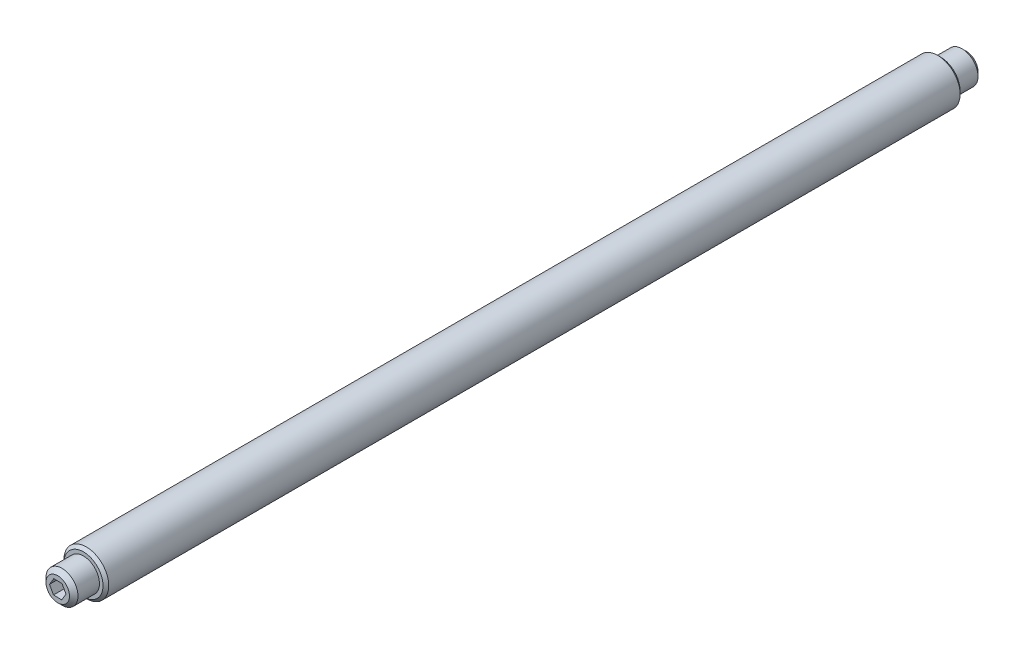
ISO-10303-21;
HEADER;
FILE_DESCRIPTION(('STEP AP214'),'2;1');
FILE_NAME('part.step','',(''),(''),'','','');
FILE_SCHEMA(('AUTOMOTIVE_DESIGN { 1 0 10303 214 1 1 1 1 }'));
ENDSEC;
DATA;
#1=APPLICATION_CONTEXT('core data for automotive mechanical design processes');
#2=APPLICATION_PROTOCOL_DEFINITION('international standard','automotive_design',2000,#1);
#3=PRODUCT_CONTEXT('',#1,'mechanical');
#4=PRODUCT('Part','Part','',(#3));
#5=PRODUCT_RELATED_PRODUCT_CATEGORY('part','',(#4));
#6=PRODUCT_DEFINITION_FORMATION('','',#4);
#7=PRODUCT_DEFINITION_CONTEXT('part definition',#1,'design');
#8=PRODUCT_DEFINITION('design','',#6,#7);
#9=PRODUCT_DEFINITION_SHAPE('','',#8);
#10=(LENGTH_UNIT() NAMED_UNIT(*) SI_UNIT(.MILLI.,.METRE.));
#11=(NAMED_UNIT(*) PLANE_ANGLE_UNIT() SI_UNIT($,.RADIAN.));
#12=(NAMED_UNIT(*) SI_UNIT($,.STERADIAN.) SOLID_ANGLE_UNIT());
#13=UNCERTAINTY_MEASURE_WITH_UNIT(LENGTH_MEASURE(1.E-05),#10,'distance_accuracy_value','');
#14=(GEOMETRIC_REPRESENTATION_CONTEXT(3) GLOBAL_UNCERTAINTY_ASSIGNED_CONTEXT((#13)) GLOBAL_UNIT_ASSIGNED_CONTEXT((#10,
#11,#12)) REPRESENTATION_CONTEXT('',''));
#15=CARTESIAN_POINT('',(0.,0.,0.));
#16=DIRECTION('',(0.,0.,1.));
#17=DIRECTION('',(1.,0.,0.));
#18=AXIS2_PLACEMENT_3D('',#15,#16,#17);
#19=CARTESIAN_POINT('',(0.,0.,-40.386));
#20=DIRECTION('',(0.,0.,-1.));
#21=DIRECTION('',(-0.974546772757791,0.224184271766274,0.));
#22=AXIS2_PLACEMENT_3D('',#19,#20,#21);
#23=PLANE('',#22);
#24=CARTESIAN_POINT('',(0.,0.,-40.386));
#25=DIRECTION('',(0.,0.,-1.));
#26=DIRECTION('',(-0.974546772757791,0.224184271766274,0.));
#27=AXIS2_PLACEMENT_3D('',#24,#25,#26);
#28=CIRCLE('',#27,1.04394);
#29=CARTESIAN_POINT('',(-1.01736835795277,0.234034928667684,-40.386));
#30=VERTEX_POINT('',#29);
#31=EDGE_CURVE('P0_E11',#30,#30,#28,.T.);
#32=ORIENTED_EDGE('',*,*,#31,.T.);
#33=EDGE_LOOP('',(#32));
#34=FACE_BOUND('',#33,.T.);
#35=DIRECTION('',(0.974546772757791,-0.224184271766274,0.));
#36=VECTOR('',#35,1.);
#37=CARTESIAN_POINT('',(-0.214928811837806,0.701027060230436,-40.386));
#38=LINE('',#37,#36);
#39=CARTESIAN_POINT('',(-0.214928811837806,0.701027060230436,-40.386));
#40=VERTEX_POINT('',#39);
#41=CARTESIAN_POINT('',(0.499642836980975,0.536647341171967,-40.386));
#42=VERTEX_POINT('',#41);
#43=EDGE_CURVE('P0_E78',#40,#42,#38,.T.);
#44=ORIENTED_EDGE('',*,*,#43,.F.);
#45=DIRECTION('',(-0.681422660857403,-0.731890126501251,0.));
#46=VECTOR('',#45,1.);
#47=CARTESIAN_POINT('',(-0.214928811837806,0.701027060230436,-40.386));
#48=LINE('',#47,#46);
#49=CARTESIAN_POINT('',(-0.714571648818781,0.164379719058474,-40.386));
#50=VERTEX_POINT('',#49);
#51=EDGE_CURVE('P0_E31',#40,#50,#48,.T.);
#52=ORIENTED_EDGE('',*,*,#51,.T.);
#53=DIRECTION('',(-0.293124111900388,0.956074398267524,0.));
#54=VECTOR('',#53,1.);
#55=CARTESIAN_POINT('',(-0.499642836980973,-0.536647341171958,-40.386));
#56=LINE('',#55,#54);
#57=CARTESIAN_POINT('',(-0.499642836980973,-0.536647341171958,-40.386));
#58=VERTEX_POINT('',#57);
#59=EDGE_CURVE('P0_E84',#58,#50,#56,.T.);
#60=ORIENTED_EDGE('',*,*,#59,.F.);
#61=DIRECTION('',(0.974546772757791,-0.224184271766274,0.));
#62=VECTOR('',#61,1.);
#63=CARTESIAN_POINT('',(-0.499642836980973,-0.536647341171958,-40.386));
#64=LINE('',#63,#62);
#65=CARTESIAN_POINT('',(0.214928811837808,-0.701027060230428,-40.386));
#66=VERTEX_POINT('',#65);
#67=EDGE_CURVE('P0_E104',#58,#66,#64,.T.);
#68=ORIENTED_EDGE('',*,*,#67,.T.);
#69=DIRECTION('',(0.681422660857403,0.731890126501251,0.));
#70=VECTOR('',#69,1.);
#71=CARTESIAN_POINT('',(0.214928811837808,-0.701027060230428,-40.386));
#72=LINE('',#71,#70);
#73=CARTESIAN_POINT('',(0.714571648818782,-0.164379719058465,-40.386));
#74=VERTEX_POINT('',#73);
#75=EDGE_CURVE('P0_E107',#66,#74,#72,.T.);
#76=ORIENTED_EDGE('',*,*,#75,.T.);
#77=DIRECTION('',(0.293124111900388,-0.956074398267524,0.));
#78=VECTOR('',#77,1.);
#79=CARTESIAN_POINT('',(0.499642836980975,0.536647341171967,-40.386));
#80=LINE('',#79,#78);
#81=EDGE_CURVE('P0_E110',#42,#74,#80,.T.);
#82=ORIENTED_EDGE('',*,*,#81,.F.);
#83=EDGE_LOOP('',(#44,#52,#60,#68,#76,#82));
#84=FACE_BOUND('',#83,.T.);
#85=ADVANCED_FACE('P0_F17',(#34,#84),#23,.T.);
#86=CARTESIAN_POINT('',(0.,0.,-40.386));
#87=DIRECTION('',(0.,0.,1.));
#88=DIRECTION('',(0.974546772757791,-0.224184271766274,0.));
#89=AXIS2_PLACEMENT_3D('',#86,#87,#88);
#90=CONICAL_SURFACE('',#89,1.04394,0.785398163397426);
#91=CARTESIAN_POINT('',(0.,0.,-40.00754));
#92=DIRECTION('',(0.,0.,-1.));
#93=DIRECTION('',(-0.974546772757791,0.224184271766274,0.));
#94=AXIS2_PLACEMENT_3D('',#91,#92,#93);
#95=CIRCLE('',#94,1.4224);
#96=CARTESIAN_POINT('',(-1.38619532957068,0.318879708160348,-40.00754));
#97=VERTEX_POINT('',#96);
#98=EDGE_CURVE('P0_E24',#97,#97,#95,.T.);
#99=ORIENTED_EDGE('',*,*,#98,.T.);
#100=EDGE_LOOP('',(#99));
#101=FACE_BOUND('',#100,.T.);
#102=ORIENTED_EDGE('',*,*,#31,.F.);
#103=EDGE_LOOP('',(#102));
#104=FACE_BOUND('',#103,.T.);
#105=ADVANCED_FACE('P0_F130',(#101,#104),#90,.T.);
#106=CARTESIAN_POINT('',(0.,0.,-53.086));
#107=DIRECTION('',(0.,0.,-1.));
#108=DIRECTION('',(-0.974546772757791,0.224184271766274,0.));
#109=AXIS2_PLACEMENT_3D('',#106,#107,#108);
#110=CYLINDRICAL_SURFACE('',#109,1.4224);
#111=CARTESIAN_POINT('',(0.,0.,-34.6837));
#112=DIRECTION('',(0.,0.,-1.));
#113=DIRECTION('',(-0.974546772757791,0.224184271766274,0.));
#114=AXIS2_PLACEMENT_3D('',#111,#112,#113);
#115=CIRCLE('',#114,1.4224);
#116=CARTESIAN_POINT('',(-1.38619532957068,0.318879708160348,-34.6837));
#117=VERTEX_POINT('',#116);
#118=EDGE_CURVE('P0_E125',#117,#117,#115,.T.);
#119=ORIENTED_EDGE('',*,*,#118,.T.);
#120=EDGE_LOOP('',(#119));
#121=FACE_BOUND('',#120,.T.);
#122=ORIENTED_EDGE('',*,*,#98,.F.);
#123=EDGE_LOOP('',(#122));
#124=FACE_BOUND('',#123,.T.);
#125=ADVANCED_FACE('P0_F133',(#121,#124),#110,.T.);
#126=CARTESIAN_POINT('',(0.,0.,-34.6837));
#127=DIRECTION('',(0.,0.,-1.));
#128=DIRECTION('',(-0.974546772757791,0.224184271766274,0.));
#129=AXIS2_PLACEMENT_3D('',#126,#127,#128);
#130=CONICAL_SURFACE('',#129,1.4224,0.785398163397453);
#131=CARTESIAN_POINT('',(0.,0.,-34.036));
#132=DIRECTION('',(0.,0.,-1.));
#133=DIRECTION('',(-0.974546772757791,0.224184271766274,0.));
#134=AXIS2_PLACEMENT_3D('',#131,#132,#133);
#135=CIRCLE('',#134,0.7747);
#136=CARTESIAN_POINT('',(-0.75498138485546,0.173675555337332,-34.036));
#137=VERTEX_POINT('',#136);
#138=EDGE_CURVE('P0_E85',#137,#137,#135,.T.);
#139=ORIENTED_EDGE('',*,*,#138,.T.);
#140=EDGE_LOOP('',(#139));
#141=FACE_BOUND('',#140,.T.);
#142=ORIENTED_EDGE('',*,*,#118,.F.);
#143=EDGE_LOOP('',(#142));
#144=FACE_BOUND('',#143,.T.);
#145=ADVANCED_FACE('P0_F135',(#141,#144),#130,.T.);
#146=CARTESIAN_POINT('',(0.,0.,-34.5014867215607));
#147=DIRECTION('',(0.,0.,1.));
#148=DIRECTION('',(0.974546772757791,-0.224184271766274,0.));
#149=AXIS2_PLACEMENT_3D('',#146,#147,#148);
#150=CONICAL_SURFACE('',#149,0.,1.02974425867666);
#151=ORIENTED_EDGE('',*,*,#138,.F.);
#152=EDGE_LOOP('',(#151));
#153=FACE_BOUND('',#152,.T.);
#154=CARTESIAN_POINT('',(0.,0.,-34.5014867215607));
#155=VERTEX_POINT('',#154);
#156=VERTEX_LOOP('',#155);
#157=FACE_BOUND('',#156,.T.);
#158=ADVANCED_FACE('P0_F143',(#153,#157),#150,.F.);
#159=CARTESIAN_POINT('',(-0.214928811837806,0.701027060230436,-38.608));
#160=DIRECTION('',(0.73189012650125,-0.681422660857403,0.));
#161=DIRECTION('',(0.681422660857403,0.731890126501251,0.));
#162=AXIS2_PLACEMENT_3D('',#159,#160,#161);
#163=PLANE('',#162);
#164=ORIENTED_EDGE('',*,*,#51,.F.);
#165=DIRECTION('',(0.,0.,-1.));
#166=VECTOR('',#165,1.);
#167=CARTESIAN_POINT('',(-0.214928811837806,0.701027060230436,-38.608));
#168=LINE('',#167,#166);
#169=CARTESIAN_POINT('',(-0.214928811837806,0.701027060230436,-38.608));
#170=VERTEX_POINT('',#169);
#171=EDGE_CURVE('P0_E72',#170,#40,#168,.T.);
#172=ORIENTED_EDGE('',*,*,#171,.F.);
#173=DIRECTION('',(-0.681422660857403,-0.731890126501251,0.));
#174=VECTOR('',#173,1.);
#175=CARTESIAN_POINT('',(-0.214928811837806,0.701027060230436,-38.608));
#176=LINE('',#175,#174);
#177=CARTESIAN_POINT('',(-0.71457164881878,0.164379719058474,-38.608));
#178=VERTEX_POINT('',#177);
#179=EDGE_CURVE('P0_E67',#170,#178,#176,.T.);
#180=ORIENTED_EDGE('',*,*,#179,.T.);
#181=DIRECTION('',(0.,0.,-1.));
#182=VECTOR('',#181,1.);
#183=CARTESIAN_POINT('',(-0.71457164881878,0.164379719058474,-38.608));
#184=LINE('',#183,#182);
#185=EDGE_CURVE('P0_E70',#178,#50,#184,.T.);
#186=ORIENTED_EDGE('',*,*,#185,.T.);
#187=EDGE_LOOP('',(#164,#172,#180,#186));
#188=FACE_BOUND('',#187,.T.);
#189=ADVANCED_FACE('P0_F69',(#188),#163,.T.);
#190=CARTESIAN_POINT('',(-0.499642836980973,-0.536647341171958,-38.608));
#191=DIRECTION('',(-0.956074398267524,-0.293124111900388,0.));
#192=DIRECTION('',(0.293124111900388,-0.956074398267524,0.));
#193=AXIS2_PLACEMENT_3D('',#190,#191,#192);
#194=PLANE('',#193);
#195=ORIENTED_EDGE('',*,*,#59,.T.);
#196=ORIENTED_EDGE('',*,*,#185,.F.);
#197=DIRECTION('',(-0.293124111900388,0.956074398267524,0.));
#198=VECTOR('',#197,1.);
#199=CARTESIAN_POINT('',(-0.499642836980973,-0.536647341171958,-38.608));
#200=LINE('',#199,#198);
#201=CARTESIAN_POINT('',(-0.499642836980973,-0.536647341171958,-38.608));
#202=VERTEX_POINT('',#201);
#203=EDGE_CURVE('P0_E77',#202,#178,#200,.T.);
#204=ORIENTED_EDGE('',*,*,#203,.F.);
#205=DIRECTION('',(0.,0.,-1.));
#206=VECTOR('',#205,1.);
#207=CARTESIAN_POINT('',(-0.499642836980973,-0.536647341171958,-38.608));
#208=LINE('',#207,#206);
#209=EDGE_CURVE('P0_E86',#202,#58,#208,.T.);
#210=ORIENTED_EDGE('',*,*,#209,.T.);
#211=EDGE_LOOP('',(#195,#196,#204,#210));
#212=FACE_BOUND('',#211,.T.);
#213=ADVANCED_FACE('P0_F82',(#212),#194,.F.);
#214=CARTESIAN_POINT('',(-0.499642836980973,-0.536647341171958,-38.608));
#215=DIRECTION('',(0.224184271766274,0.974546772757791,0.));
#216=DIRECTION('',(-0.974546772757791,0.224184271766274,0.));
#217=AXIS2_PLACEMENT_3D('',#214,#215,#216);
#218=PLANE('',#217);
#219=ORIENTED_EDGE('',*,*,#67,.F.);
#220=ORIENTED_EDGE('',*,*,#209,.F.);
#221=DIRECTION('',(0.974546772757791,-0.224184271766274,0.));
#222=VECTOR('',#221,1.);
#223=CARTESIAN_POINT('',(-0.499642836980973,-0.536647341171958,-38.608));
#224=LINE('',#223,#222);
#225=CARTESIAN_POINT('',(0.214928811837808,-0.701027060230428,-38.608));
#226=VERTEX_POINT('',#225);
#227=EDGE_CURVE('P0_E91',#202,#226,#224,.T.);
#228=ORIENTED_EDGE('',*,*,#227,.T.);
#229=DIRECTION('',(0.,0.,-1.));
#230=VECTOR('',#229,1.);
#231=CARTESIAN_POINT('',(0.214928811837808,-0.701027060230428,-38.608));
#232=LINE('',#231,#230);
#233=EDGE_CURVE('P0_E120',#226,#66,#232,.T.);
#234=ORIENTED_EDGE('',*,*,#233,.T.);
#235=EDGE_LOOP('',(#219,#220,#228,#234));
#236=FACE_BOUND('',#235,.T.);
#237=ADVANCED_FACE('P0_F166',(#236),#218,.T.);
#238=CARTESIAN_POINT('',(0.214928811837808,-0.701027060230428,-38.608));
#239=DIRECTION('',(-0.731890126501251,0.681422660857403,0.));
#240=DIRECTION('',(-0.681422660857403,-0.731890126501251,0.));
#241=AXIS2_PLACEMENT_3D('',#238,#239,#240);
#242=PLANE('',#241);
#243=ORIENTED_EDGE('',*,*,#75,.F.);
#244=ORIENTED_EDGE('',*,*,#233,.F.);
#245=DIRECTION('',(0.681422660857403,0.731890126501251,0.));
#246=VECTOR('',#245,1.);
#247=CARTESIAN_POINT('',(0.214928811837808,-0.701027060230428,-38.608));
#248=LINE('',#247,#246);
#249=CARTESIAN_POINT('',(0.714571648818782,-0.164379719058465,-38.608));
#250=VERTEX_POINT('',#249);
#251=EDGE_CURVE('P0_E93',#226,#250,#248,.T.);
#252=ORIENTED_EDGE('',*,*,#251,.T.);
#253=DIRECTION('',(0.,0.,-1.));
#254=VECTOR('',#253,1.);
#255=CARTESIAN_POINT('',(0.714571648818782,-0.164379719058465,-38.608));
#256=LINE('',#255,#254);
#257=EDGE_CURVE('P0_E118',#250,#74,#256,.T.);
#258=ORIENTED_EDGE('',*,*,#257,.T.);
#259=EDGE_LOOP('',(#243,#244,#252,#258));
#260=FACE_BOUND('',#259,.T.);
#261=ADVANCED_FACE('P0_F162',(#260),#242,.T.);
#262=CARTESIAN_POINT('',(0.499642836980975,0.536647341171967,-38.608));
#263=DIRECTION('',(0.956074398267524,0.293124111900388,0.));
#264=DIRECTION('',(-0.293124111900388,0.956074398267524,0.));
#265=AXIS2_PLACEMENT_3D('',#262,#263,#264);
#266=PLANE('',#265);
#267=ORIENTED_EDGE('',*,*,#81,.T.);
#268=ORIENTED_EDGE('',*,*,#257,.F.);
#269=DIRECTION('',(0.293124111900388,-0.956074398267524,0.));
#270=VECTOR('',#269,1.);
#271=CARTESIAN_POINT('',(0.499642836980975,0.536647341171967,-38.608));
#272=LINE('',#271,#270);
#273=CARTESIAN_POINT('',(0.499642836980975,0.536647341171967,-38.608));
#274=VERTEX_POINT('',#273);
#275=EDGE_CURVE('P0_E97',#274,#250,#272,.T.);
#276=ORIENTED_EDGE('',*,*,#275,.F.);
#277=DIRECTION('',(0.,0.,-1.));
#278=VECTOR('',#277,1.);
#279=CARTESIAN_POINT('',(0.499642836980975,0.536647341171967,-38.608));
#280=LINE('',#279,#278);
#281=EDGE_CURVE('P0_E116',#274,#42,#280,.T.);
#282=ORIENTED_EDGE('',*,*,#281,.T.);
#283=EDGE_LOOP('',(#267,#268,#276,#282));
#284=FACE_BOUND('',#283,.T.);
#285=ADVANCED_FACE('P0_F159',(#284),#266,.F.);
#286=CARTESIAN_POINT('',(-0.214928811837806,0.701027060230436,-38.608));
#287=DIRECTION('',(0.224184271766274,0.974546772757791,0.));
#288=DIRECTION('',(-0.974546772757791,0.224184271766274,0.));
#289=AXIS2_PLACEMENT_3D('',#286,#287,#288);
#290=PLANE('',#289);
#291=ORIENTED_EDGE('',*,*,#43,.T.);
#292=ORIENTED_EDGE('',*,*,#281,.F.);
#293=DIRECTION('',(0.974546772757791,-0.224184271766274,0.));
#294=VECTOR('',#293,1.);
#295=CARTESIAN_POINT('',(-0.214928811837806,0.701027060230436,-38.608));
#296=LINE('',#295,#294);
#297=EDGE_CURVE('P0_E100',#170,#274,#296,.T.);
#298=ORIENTED_EDGE('',*,*,#297,.F.);
#299=ORIENTED_EDGE('',*,*,#171,.T.);
#300=EDGE_LOOP('',(#291,#292,#298,#299));
#301=FACE_BOUND('',#300,.T.);
#302=ADVANCED_FACE('P0_F155',(#301),#290,.F.);
#303=CARTESIAN_POINT('',(-0.714571648818781,0.164379719058474,-38.608));
#304=DIRECTION('',(0.,0.,-1.));
#305=DIRECTION('',(-0.974546772757791,0.224184271766274,0.));
#306=AXIS2_PLACEMENT_3D('',#303,#304,#305);
#307=PLANE('',#306);
#308=ORIENTED_EDGE('',*,*,#179,.F.);
#309=ORIENTED_EDGE('',*,*,#297,.T.);
#310=ORIENTED_EDGE('',*,*,#275,.T.);
#311=ORIENTED_EDGE('',*,*,#251,.F.);
#312=ORIENTED_EDGE('',*,*,#227,.F.);
#313=ORIENTED_EDGE('',*,*,#203,.T.);
#314=EDGE_LOOP('',(#308,#309,#310,#311,#312,#313));
#315=FACE_BOUND('',#314,.T.);
#316=ADVANCED_FACE('P0_F89',(#315),#307,.T.);
#317=CLOSED_SHELL('',(#85,#105,#125,#145,#158,#189,#213,#237,#261,#285,#302,#316));
#318=MANIFOLD_SOLID_BREP('P0_B1',#317);
#319=CARTESIAN_POINT('',(0.,0.,38.1));
#320=DIRECTION('',(0.,0.,-1.));
#321=DIRECTION('',(-1.,0.,0.));
#322=AXIS2_PLACEMENT_3D('',#319,#320,#321);
#323=CYLINDRICAL_SURFACE('',#322,1.9939);
#324=CARTESIAN_POINT('',(0.,0.,37.846));
#325=DIRECTION('',(0.,0.,1.));
#326=DIRECTION('',(1.,0.,0.));
#327=AXIS2_PLACEMENT_3D('',#324,#325,#326);
#328=CIRCLE('',#327,1.9939);
#329=CARTESIAN_POINT('',(-1.9939,0.,37.846));
#330=VERTEX_POINT('',#329);
#331=EDGE_CURVE('P1_E11',#330,#330,#328,.F.);
#332=CARTESIAN_POINT('',(0.,0.,-37.846));
#333=DIRECTION('',(0.,0.,1.));
#334=DIRECTION('',(1.,0.,0.));
#335=AXIS2_PLACEMENT_3D('',#332,#333,#334);
#336=CIRCLE('',#335,1.9939);
#337=CARTESIAN_POINT('',(-1.9939,0.,-37.846));
#338=VERTEX_POINT('',#337);
#339=EDGE_CURVE('P1_E63',#338,#338,#336,.T.);
#340=CARTESIAN_POINT('',(-1.9939,0.,37.846));
#341=CARTESIAN_POINT('',(-1.9939,0.,37.0575416666667));
#342=CARTESIAN_POINT('',(-1.9939,0.,36.2690833333334));
#343=CARTESIAN_POINT('',(-1.9939,0.,34.6921666666667));
#344=CARTESIAN_POINT('',(-1.9939,0.,33.9037083333334));
#345=CARTESIAN_POINT('',(-1.9939,0.,32.3267916666667));
#346=CARTESIAN_POINT('',(-1.9939,0.,31.5383333333334));
#347=CARTESIAN_POINT('',(-1.9939,0.,29.9614166666667));
#348=CARTESIAN_POINT('',(-1.9939,0.,29.1729583333334));
#349=CARTESIAN_POINT('',(-1.9939,0.,27.5960416666667));
#350=CARTESIAN_POINT('',(-1.9939,0.,26.8075833333334));
#351=CARTESIAN_POINT('',(-1.9939,0.,25.2306666666667));
#352=CARTESIAN_POINT('',(-1.9939,0.,24.4422083333334));
#353=CARTESIAN_POINT('',(-1.9939,0.,22.8652916666667));
#354=CARTESIAN_POINT('',(-1.9939,0.,22.0768333333334));
#355=CARTESIAN_POINT('',(-1.9939,0.,20.4999166666667));
#356=CARTESIAN_POINT('',(-1.9939,0.,19.7114583333334));
#357=CARTESIAN_POINT('',(-1.9939,0.,18.1345416666667));
#358=CARTESIAN_POINT('',(-1.9939,0.,17.3460833333334));
#359=CARTESIAN_POINT('',(-1.9939,0.,15.7691666666667));
#360=CARTESIAN_POINT('',(-1.9939,0.,14.9807083333334));
#361=CARTESIAN_POINT('',(-1.9939,0.,13.4037916666667));
#362=CARTESIAN_POINT('',(-1.9939,0.,12.6153333333334));
#363=CARTESIAN_POINT('',(-1.9939,0.,11.0384166666667));
#364=CARTESIAN_POINT('',(-1.9939,0.,10.2499583333334));
#365=CARTESIAN_POINT('',(-1.9939,0.,8.6730416666667));
#366=CARTESIAN_POINT('',(-1.9939,0.,7.88458333333336));
#367=CARTESIAN_POINT('',(-1.9939,0.,6.30766666666669));
#368=CARTESIAN_POINT('',(-1.9939,0.,5.51920833333336));
#369=CARTESIAN_POINT('',(-1.9939,0.,3.94229166666669));
#370=CARTESIAN_POINT('',(-1.9939,0.,3.15383333333336));
#371=CARTESIAN_POINT('',(-1.9939,0.,1.5769166666667));
#372=CARTESIAN_POINT('',(-1.9939,0.,0.788458333333362));
#373=CARTESIAN_POINT('',(-1.9939,0.,-0.788458333333307));
#374=CARTESIAN_POINT('',(-1.9939,0.,-1.57691666666664));
#375=CARTESIAN_POINT('',(-1.9939,0.,-3.15383333333331));
#376=CARTESIAN_POINT('',(-1.9939,0.,-3.94229166666664));
#377=CARTESIAN_POINT('',(-1.9939,0.,-5.51920833333331));
#378=CARTESIAN_POINT('',(-1.9939,0.,-6.30766666666664));
#379=CARTESIAN_POINT('',(-1.9939,0.,-7.88458333333331));
#380=CARTESIAN_POINT('',(-1.9939,0.,-8.67304166666664));
#381=CARTESIAN_POINT('',(-1.9939,0.,-10.2499583333333));
#382=CARTESIAN_POINT('',(-1.9939,0.,-11.0384166666666));
#383=CARTESIAN_POINT('',(-1.9939,0.,-12.6153333333333));
#384=CARTESIAN_POINT('',(-1.9939,0.,-13.4037916666666));
#385=CARTESIAN_POINT('',(-1.9939,0.,-14.9807083333333));
#386=CARTESIAN_POINT('',(-1.9939,0.,-15.7691666666666));
#387=CARTESIAN_POINT('',(-1.9939,0.,-17.3460833333333));
#388=CARTESIAN_POINT('',(-1.9939,0.,-18.1345416666666));
#389=CARTESIAN_POINT('',(-1.9939,0.,-19.7114583333333));
#390=CARTESIAN_POINT('',(-1.9939,0.,-20.4999166666666));
#391=CARTESIAN_POINT('',(-1.9939,0.,-22.0768333333333));
#392=CARTESIAN_POINT('',(-1.9939,0.,-22.8652916666666));
#393=CARTESIAN_POINT('',(-1.9939,0.,-24.4422083333333));
#394=CARTESIAN_POINT('',(-1.9939,0.,-25.2306666666666));
#395=CARTESIAN_POINT('',(-1.9939,0.,-26.8075833333333));
#396=CARTESIAN_POINT('',(-1.9939,0.,-27.5960416666666));
#397=CARTESIAN_POINT('',(-1.9939,0.,-29.1729583333333));
#398=CARTESIAN_POINT('',(-1.9939,0.,-29.9614166666666));
#399=CARTESIAN_POINT('',(-1.9939,0.,-31.5383333333333));
#400=CARTESIAN_POINT('',(-1.9939,0.,-32.3267916666666));
#401=CARTESIAN_POINT('',(-1.9939,0.,-33.9037083333333));
#402=CARTESIAN_POINT('',(-1.9939,0.,-34.6921666666666));
#403=CARTESIAN_POINT('',(-1.9939,0.,-36.2690833333333));
#404=CARTESIAN_POINT('',(-1.9939,0.,-37.0575416666666));
#405=CARTESIAN_POINT('',(-1.9939,0.,-37.846));
#406=B_SPLINE_CURVE_WITH_KNOTS('',3,(#340,#341,#342,#343,#344,#345,#346,#347,#348,#349,#350,
#351,#352,#353,#354,#355,#356,#357,#358,#359,#360,#361,#362,#363,#364,#365,#366,#367,#368,#369,
#370,#371,#372,#373,#374,#375,#376,#377,#378,#379,#380,#381,#382,#383,#384,#385,#386,#387,#388,
#389,#390,#391,#392,#393,#394,#395,#396,#397,#398,#399,#400,#401,#402,#403,#404,#405),
.UNSPECIFIED.,.F.,.F.,(4,2,2,2,2,2,2,2,2,2,2,2,2,2,2,2,2,2,2,2,2,2,2,2,2,2,2,2,2,2,2,2,4),(0.,
2.365375,4.73075,7.09612499999999,9.4615,11.826875,14.19225,16.557625,18.923,21.288375,23.65375,
26.019125,28.3845,30.749875,33.11525,35.480625,37.846,40.211375,42.57675,44.942125,47.3075,
49.672875,52.03825,54.403625,56.769,59.134375,61.49975,63.865125,66.2305,68.595875,70.96125,
73.326625,75.692),.UNSPECIFIED.);
#407=EDGE_CURVE('P1_BSEAM17',#330,#338,#406,.T.);
#408=ORIENTED_EDGE('',*,*,#331,.T.);
#409=ORIENTED_EDGE('',*,*,#339,.T.);
#410=ORIENTED_EDGE('',*,*,#407,.T.);
#411=ORIENTED_EDGE('',*,*,#407,.F.);
#412=EDGE_LOOP('',(#408,#410,#409,#411));
#413=FACE_BOUND('',#412,.T.);
#414=ADVANCED_FACE('P1_F17',(#413),#323,.T.);
#415=CARTESIAN_POINT('',(0.,0.,38.1));
#416=DIRECTION('',(0.,0.,1.));
#417=DIRECTION('',(1.,0.,0.));
#418=AXIS2_PLACEMENT_3D('',#415,#416,#417);
#419=PLANE('',#418);
#420=CARTESIAN_POINT('',(0.,0.,38.1));
#421=DIRECTION('',(0.,0.,1.));
#422=DIRECTION('',(1.,0.,0.));
#423=AXIS2_PLACEMENT_3D('',#420,#421,#422);
#424=CIRCLE('',#423,1.42239999999999);
#425=CARTESIAN_POINT('',(1.42239999999999,0.,38.1));
#426=VERTEX_POINT('',#425);
#427=EDGE_CURVE('P1_E60',#426,#426,#424,.T.);
#428=ORIENTED_EDGE('',*,*,#427,.F.);
#429=EDGE_LOOP('',(#428));
#430=FACE_BOUND('',#429,.T.);
#431=CARTESIAN_POINT('',(0.,0.,38.1));
#432=DIRECTION('',(0.,0.,1.));
#433=DIRECTION('',(1.,0.,0.));
#434=AXIS2_PLACEMENT_3D('',#431,#432,#433);
#435=CIRCLE('',#434,1.73990000000003);
#436=CARTESIAN_POINT('',(1.73990000000003,0.,38.1));
#437=VERTEX_POINT('',#436);
#438=EDGE_CURVE('P1_E25',#437,#437,#435,.T.);
#439=ORIENTED_EDGE('',*,*,#438,.T.);
#440=EDGE_LOOP('',(#439));
#441=FACE_BOUND('',#440,.T.);
#442=ADVANCED_FACE('P1_F71',(#430,#441),#419,.T.);
#443=CARTESIAN_POINT('',(0.,0.,-38.1));
#444=DIRECTION('',(0.,0.,1.));
#445=DIRECTION('',(1.,0.,0.));
#446=AXIS2_PLACEMENT_3D('',#443,#444,#445);
#447=PLANE('',#446);
#448=CARTESIAN_POINT('',(0.,0.,-38.1));
#449=DIRECTION('',(0.,0.,-1.));
#450=DIRECTION('',(-1.,0.,0.));
#451=AXIS2_PLACEMENT_3D('',#448,#449,#450);
#452=CIRCLE('',#451,1.42239999999999);
#453=CARTESIAN_POINT('',(-1.42239999999999,0.,-38.1));
#454=VERTEX_POINT('',#453);
#455=EDGE_CURVE('P1_E48',#454,#454,#452,.T.);
#456=ORIENTED_EDGE('',*,*,#455,.F.);
#457=EDGE_LOOP('',(#456));
#458=FACE_BOUND('',#457,.T.);
#459=CARTESIAN_POINT('',(0.,0.,-38.1));
#460=DIRECTION('',(0.,0.,1.));
#461=DIRECTION('',(1.,0.,0.));
#462=AXIS2_PLACEMENT_3D('',#459,#460,#461);
#463=CIRCLE('',#462,1.73989999999995);
#464=CARTESIAN_POINT('',(1.73989999999995,0.,-38.1));
#465=VERTEX_POINT('',#464);
#466=EDGE_CURVE('P1_E66',#465,#465,#463,.F.);
#467=ORIENTED_EDGE('',*,*,#466,.T.);
#468=EDGE_LOOP('',(#467));
#469=FACE_BOUND('',#468,.T.);
#470=ADVANCED_FACE('P1_F86',(#458,#469),#447,.F.);
#471=CARTESIAN_POINT('',(0.,0.,-37.846));
#472=DIRECTION('',(0.,0.,1.));
#473=DIRECTION('',(1.,0.,0.));
#474=AXIS2_PLACEMENT_3D('',#471,#472,#473);
#475=CONICAL_SURFACE('',#474,1.9939,0.785398163397463);
#476=ORIENTED_EDGE('',*,*,#466,.F.);
#477=EDGE_LOOP('',(#476));
#478=FACE_BOUND('',#477,.T.);
#479=ORIENTED_EDGE('',*,*,#339,.F.);
#480=EDGE_LOOP('',(#479));
#481=FACE_BOUND('',#480,.T.);
#482=ADVANCED_FACE('P1_F75',(#478,#481),#475,.T.);
#483=CARTESIAN_POINT('',(0.,0.,38.1));
#484=DIRECTION('',(0.,0.,-1.));
#485=DIRECTION('',(-1.,0.,0.));
#486=AXIS2_PLACEMENT_3D('',#483,#484,#485);
#487=CONICAL_SURFACE('',#486,1.73990000000003,0.785398163397449);
#488=ORIENTED_EDGE('',*,*,#331,.F.);
#489=EDGE_LOOP('',(#488));
#490=FACE_BOUND('',#489,.T.);
#491=ORIENTED_EDGE('',*,*,#438,.F.);
#492=EDGE_LOOP('',(#491));
#493=FACE_BOUND('',#492,.T.);
#494=ADVANCED_FACE('P1_F19',(#490,#493),#487,.T.);
#495=CARTESIAN_POINT('',(0.,0.,38.1));
#496=DIRECTION('',(0.,0.,1.));
#497=DIRECTION('',(1.,0.,0.));
#498=AXIS2_PLACEMENT_3D('',#495,#496,#497);
#499=CYLINDRICAL_SURFACE('',#498,1.4224);
#500=CARTESIAN_POINT('',(0.,0.,34.036));
#501=DIRECTION('',(0.,0.,1.));
#502=DIRECTION('',(1.,0.,0.));
#503=AXIS2_PLACEMENT_3D('',#500,#501,#502);
#504=CIRCLE('',#503,1.4224);
#505=CARTESIAN_POINT('',(1.4224,0.,34.036));
#506=VERTEX_POINT('',#505);
#507=EDGE_CURVE('P1_E57',#506,#506,#504,.T.);
#508=ORIENTED_EDGE('',*,*,#507,.F.);
#509=EDGE_LOOP('',(#508));
#510=FACE_BOUND('',#509,.T.);
#511=ORIENTED_EDGE('',*,*,#427,.T.);
#512=EDGE_LOOP('',(#511));
#513=FACE_BOUND('',#512,.T.);
#514=ADVANCED_FACE('P1_F74',(#510,#513),#499,.F.);
#515=CARTESIAN_POINT('',(1.1303,0.,34.036));
#516=DIRECTION('',(0.,0.,-1.));
#517=DIRECTION('',(-1.,0.,0.));
#518=AXIS2_PLACEMENT_3D('',#515,#516,#517);
#519=PLANE('',#518);
#520=CARTESIAN_POINT('',(0.,0.,34.036));
#521=DIRECTION('',(0.,0.,1.));
#522=DIRECTION('',(1.,0.,0.));
#523=AXIS2_PLACEMENT_3D('',#520,#521,#522);
#524=CIRCLE('',#523,1.1303);
#525=CARTESIAN_POINT('',(1.1303,0.,34.036));
#526=VERTEX_POINT('',#525);
#527=EDGE_CURVE('P1_E54',#526,#526,#524,.T.);
#528=ORIENTED_EDGE('',*,*,#527,.F.);
#529=EDGE_LOOP('',(#528));
#530=FACE_BOUND('',#529,.T.);
#531=ORIENTED_EDGE('',*,*,#507,.T.);
#532=EDGE_LOOP('',(#531));
#533=FACE_BOUND('',#532,.T.);
#534=ADVANCED_FACE('P1_F83',(#530,#533),#519,.F.);
#535=CARTESIAN_POINT('',(0.,0.,38.1));
#536=DIRECTION('',(0.,0.,1.));
#537=DIRECTION('',(1.,0.,0.));
#538=AXIS2_PLACEMENT_3D('',#535,#536,#537);
#539=CYLINDRICAL_SURFACE('',#538,1.1303);
#540=CARTESIAN_POINT('',(0.,0.,33.02));
#541=DIRECTION('',(0.,0.,1.));
#542=DIRECTION('',(1.,0.,0.));
#543=AXIS2_PLACEMENT_3D('',#540,#541,#542);
#544=CIRCLE('',#543,1.1303);
#545=CARTESIAN_POINT('',(1.1303,0.,33.02));
#546=VERTEX_POINT('',#545);
#547=EDGE_CURVE('P1_E51',#546,#546,#544,.T.);
#548=ORIENTED_EDGE('',*,*,#547,.F.);
#549=EDGE_LOOP('',(#548));
#550=FACE_BOUND('',#549,.T.);
#551=ORIENTED_EDGE('',*,*,#527,.T.);
#552=EDGE_LOOP('',(#551));
#553=FACE_BOUND('',#552,.T.);
#554=ADVANCED_FACE('P1_F105',(#550,#553),#539,.F.);
#555=CARTESIAN_POINT('',(0.,0.,33.02));
#556=DIRECTION('',(0.,0.,1.));
#557=DIRECTION('',(1.,0.,0.));
#558=AXIS2_PLACEMENT_3D('',#555,#556,#557);
#559=CONICAL_SURFACE('',#558,1.1303,1.02974425867665);
#560=CARTESIAN_POINT('',(0.,0.,32.3408472423131));
#561=VERTEX_POINT('',#560);
#562=VERTEX_LOOP('',#561);
#563=FACE_BOUND('',#562,.T.);
#564=ORIENTED_EDGE('',*,*,#547,.T.);
#565=EDGE_LOOP('',(#564));
#566=FACE_BOUND('',#565,.T.);
#567=ADVANCED_FACE('P1_F109',(#563,#566),#559,.F.);
#568=CARTESIAN_POINT('',(0.,0.,-38.1));
#569=DIRECTION('',(0.,0.,-1.));
#570=DIRECTION('',(-1.,0.,0.));
#571=AXIS2_PLACEMENT_3D('',#568,#569,#570);
#572=CYLINDRICAL_SURFACE('',#571,1.4224);
#573=CARTESIAN_POINT('',(0.,0.,-34.036));
#574=DIRECTION('',(0.,0.,-1.));
#575=DIRECTION('',(-1.,0.,0.));
#576=AXIS2_PLACEMENT_3D('',#573,#574,#575);
#577=CIRCLE('',#576,1.4224);
#578=CARTESIAN_POINT('',(-1.4224,0.,-34.036));
#579=VERTEX_POINT('',#578);
#580=EDGE_CURVE('P1_E43',#579,#579,#577,.T.);
#581=ORIENTED_EDGE('',*,*,#580,.F.);
#582=EDGE_LOOP('',(#581));
#583=FACE_BOUND('',#582,.T.);
#584=ORIENTED_EDGE('',*,*,#455,.T.);
#585=EDGE_LOOP('',(#584));
#586=FACE_BOUND('',#585,.T.);
#587=ADVANCED_FACE('P1_F113',(#583,#586),#572,.F.);
#588=CARTESIAN_POINT('',(1.1303,0.,-34.036));
#589=DIRECTION('',(0.,0.,1.));
#590=DIRECTION('',(1.,0.,0.));
#591=AXIS2_PLACEMENT_3D('',#588,#589,#590);
#592=PLANE('',#591);
#593=CARTESIAN_POINT('',(0.,0.,-34.036));
#594=DIRECTION('',(0.,0.,-1.));
#595=DIRECTION('',(-1.,0.,0.));
#596=AXIS2_PLACEMENT_3D('',#593,#594,#595);
#597=CIRCLE('',#596,1.1303);
#598=CARTESIAN_POINT('',(-1.1303,0.,-34.036));
#599=VERTEX_POINT('',#598);
#600=EDGE_CURVE('P1_E40',#599,#599,#597,.T.);
#601=ORIENTED_EDGE('',*,*,#600,.F.);
#602=EDGE_LOOP('',(#601));
#603=FACE_BOUND('',#602,.T.);
#604=ORIENTED_EDGE('',*,*,#580,.T.);
#605=EDGE_LOOP('',(#604));
#606=FACE_BOUND('',#605,.T.);
#607=ADVANCED_FACE('P1_F116',(#603,#606),#592,.F.);
#608=CARTESIAN_POINT('',(0.,0.,-38.1));
#609=DIRECTION('',(0.,0.,-1.));
#610=DIRECTION('',(-1.,0.,0.));
#611=AXIS2_PLACEMENT_3D('',#608,#609,#610);
#612=CYLINDRICAL_SURFACE('',#611,1.1303);
#613=CARTESIAN_POINT('',(0.,0.,-33.02));
#614=DIRECTION('',(0.,0.,-1.));
#615=DIRECTION('',(-1.,0.,0.));
#616=AXIS2_PLACEMENT_3D('',#613,#614,#615);
#617=CIRCLE('',#616,1.1303);
#618=CARTESIAN_POINT('',(-1.1303,0.,-33.02));
#619=VERTEX_POINT('',#618);
#620=EDGE_CURVE('P1_E38',#619,#619,#617,.T.);
#621=ORIENTED_EDGE('',*,*,#620,.F.);
#622=EDGE_LOOP('',(#621));
#623=FACE_BOUND('',#622,.T.);
#624=ORIENTED_EDGE('',*,*,#600,.T.);
#625=EDGE_LOOP('',(#624));
#626=FACE_BOUND('',#625,.T.);
#627=ADVANCED_FACE('P1_F34',(#623,#626),#612,.F.);
#628=CARTESIAN_POINT('',(0.,0.,-33.02));
#629=DIRECTION('',(0.,0.,-1.));
#630=DIRECTION('',(-1.,0.,0.));
#631=AXIS2_PLACEMENT_3D('',#628,#629,#630);
#632=CONICAL_SURFACE('',#631,1.1303,1.02974425867665);
#633=CARTESIAN_POINT('',(0.,0.,-32.3408472423131));
#634=VERTEX_POINT('',#633);
#635=VERTEX_LOOP('',#634);
#636=FACE_BOUND('',#635,.T.);
#637=ORIENTED_EDGE('',*,*,#620,.T.);
#638=EDGE_LOOP('',(#637));
#639=FACE_BOUND('',#638,.T.);
#640=ADVANCED_FACE('P1_F31',(#636,#639),#632,.F.);
#641=CLOSED_SHELL('',(#414,#442,#470,#482,#494,#514,#534,#554,#567,#587,#607,#627,#640));
#642=MANIFOLD_SOLID_BREP('P1_B1',#641);
#643=CARTESIAN_POINT('',(0.,0.,40.386));
#644=DIRECTION('',(0.,0.,1.));
#645=DIRECTION('',(0.999818778951505,-0.0190370495592458,0.));
#646=AXIS2_PLACEMENT_3D('',#643,#644,#645);
#647=PLANE('',#646);
#648=CARTESIAN_POINT('',(0.,0.,40.386));
#649=DIRECTION('',(0.,0.,1.));
#650=DIRECTION('',(0.999818778951505,-0.0190370495592458,0.));
#651=AXIS2_PLACEMENT_3D('',#648,#649,#650);
#652=CIRCLE('',#651,1.04394);
#653=CARTESIAN_POINT('',(1.04375081609864,-0.019873537516879,40.386));
#654=VERTEX_POINT('',#653);
#655=EDGE_CURVE('P2_E10',#654,#654,#652,.T.);
#656=ORIENTED_EDGE('',*,*,#655,.T.);
#657=EDGE_LOOP('',(#656));
#658=FACE_BOUND('',#657,.T.);
#659=DIRECTION('',(-0.999818778951505,0.0190370495592456,0.));
#660=VECTOR('',#659,1.);
#661=CARTESIAN_POINT('',(0.378639508612116,0.62790561062258,40.386));
#662=LINE('',#661,#660);
#663=CARTESIAN_POINT('',(0.378639508612116,0.62790561062258,40.386));
#664=VERTEX_POINT('',#663);
#665=CARTESIAN_POINT('',(-0.354462455671872,0.64186423864584,40.386));
#666=VERTEX_POINT('',#665);
#667=EDGE_CURVE('P2_E77',#664,#666,#662,.T.);
#668=ORIENTED_EDGE('',*,*,#667,.F.);
#669=DIRECTION('',(0.483422820944343,-0.875386986532364,0.));
#670=VECTOR('',#669,1.);
#671=CARTESIAN_POINT('',(0.378639508612116,0.62790561062258,40.386));
#672=LINE('',#671,#670);
#673=CARTESIAN_POINT('',(0.733101964283989,-0.0139586280232562,40.386));
#674=VERTEX_POINT('',#673);
#675=EDGE_CURVE('P2_E30',#664,#674,#672,.T.);
#676=ORIENTED_EDGE('',*,*,#675,.T.);
#677=DIRECTION('',(0.516395958007163,0.856349936973119,0.));
#678=VECTOR('',#677,1.);
#679=CARTESIAN_POINT('',(0.354462455671874,-0.641864238645832,40.386));
#680=LINE('',#679,#678);
#681=CARTESIAN_POINT('',(0.354462455671874,-0.641864238645832,40.386));
#682=VERTEX_POINT('',#681);
#683=EDGE_CURVE('P2_E83',#682,#674,#680,.T.);
#684=ORIENTED_EDGE('',*,*,#683,.F.);
#685=DIRECTION('',(-0.999818778951505,0.0190370495592458,0.));
#686=VECTOR('',#685,1.);
#687=CARTESIAN_POINT('',(0.354462455671874,-0.641864238645832,40.386));
#688=LINE('',#687,#686);
#689=CARTESIAN_POINT('',(-0.378639508612114,-0.627905610622571,40.386));
#690=VERTEX_POINT('',#689);
#691=EDGE_CURVE('P2_E103',#682,#690,#688,.T.);
#692=ORIENTED_EDGE('',*,*,#691,.T.);
#693=DIRECTION('',(-0.483422820944343,0.875386986532364,0.));
#694=VECTOR('',#693,1.);
#695=CARTESIAN_POINT('',(-0.378639508612114,-0.627905610622571,40.386));
#696=LINE('',#695,#694);
#697=CARTESIAN_POINT('',(-0.733101964283987,0.0139586280232649,40.386));
#698=VERTEX_POINT('',#697);
#699=EDGE_CURVE('P2_E106',#690,#698,#696,.T.);
#700=ORIENTED_EDGE('',*,*,#699,.T.);
#701=DIRECTION('',(-0.516395958007163,-0.856349936973119,0.));
#702=VECTOR('',#701,1.);
#703=CARTESIAN_POINT('',(-0.354462455671872,0.64186423864584,40.386));
#704=LINE('',#703,#702);
#705=EDGE_CURVE('P2_E109',#666,#698,#704,.T.);
#706=ORIENTED_EDGE('',*,*,#705,.F.);
#707=EDGE_LOOP('',(#668,#676,#684,#692,#700,#706));
#708=FACE_BOUND('',#707,.T.);
#709=ADVANCED_FACE('P2_F16',(#658,#708),#647,.T.);
#710=CARTESIAN_POINT('',(0.,0.,40.386));
#711=DIRECTION('',(0.,0.,-1.));
#712=DIRECTION('',(-0.999818778951505,0.0190370495592458,0.));
#713=AXIS2_PLACEMENT_3D('',#710,#711,#712);
#714=CONICAL_SURFACE('',#713,1.04394,0.785398163397426);
#715=CARTESIAN_POINT('',(0.,0.,40.00754));
#716=DIRECTION('',(0.,0.,1.));
#717=DIRECTION('',(0.999818778951505,-0.0190370495592458,0.));
#718=AXIS2_PLACEMENT_3D('',#715,#716,#717);
#719=CIRCLE('',#718,1.4224);
#720=CARTESIAN_POINT('',(1.42214223118062,-0.0270782992930711,40.00754));
#721=VERTEX_POINT('',#720);
#722=EDGE_CURVE('P2_E23',#721,#721,#719,.T.);
#723=ORIENTED_EDGE('',*,*,#722,.T.);
#724=EDGE_LOOP('',(#723));
#725=FACE_BOUND('',#724,.T.);
#726=ORIENTED_EDGE('',*,*,#655,.F.);
#727=EDGE_LOOP('',(#726));
#728=FACE_BOUND('',#727,.T.);
#729=ADVANCED_FACE('P2_F129',(#725,#728),#714,.T.);
#730=CARTESIAN_POINT('',(0.,0.,53.086));
#731=DIRECTION('',(0.,0.,1.));
#732=DIRECTION('',(0.999818778951505,-0.0190370495592458,0.));
#733=AXIS2_PLACEMENT_3D('',#730,#731,#732);
#734=CYLINDRICAL_SURFACE('',#733,1.4224);
#735=CARTESIAN_POINT('',(0.,0.,34.6837));
#736=DIRECTION('',(0.,0.,1.));
#737=DIRECTION('',(0.999818778951505,-0.0190370495592458,0.));
#738=AXIS2_PLACEMENT_3D('',#735,#736,#737);
#739=CIRCLE('',#738,1.4224);
#740=CARTESIAN_POINT('',(1.42214223118062,-0.0270782992930711,34.6837));
#741=VERTEX_POINT('',#740);
#742=EDGE_CURVE('P2_E124',#741,#741,#739,.T.);
#743=ORIENTED_EDGE('',*,*,#742,.T.);
#744=EDGE_LOOP('',(#743));
#745=FACE_BOUND('',#744,.T.);
#746=ORIENTED_EDGE('',*,*,#722,.F.);
#747=EDGE_LOOP('',(#746));
#748=FACE_BOUND('',#747,.T.);
#749=ADVANCED_FACE('P2_F132',(#745,#748),#734,.T.);
#750=CARTESIAN_POINT('',(0.,0.,34.6837));
#751=DIRECTION('',(0.,0.,1.));
#752=DIRECTION('',(0.999818778951505,-0.0190370495592458,0.));
#753=AXIS2_PLACEMENT_3D('',#750,#751,#752);
#754=CONICAL_SURFACE('',#753,1.4224,0.785398163397453);
#755=CARTESIAN_POINT('',(0.,0.,34.036));
#756=DIRECTION('',(0.,0.,1.));
#757=DIRECTION('',(0.999818778951505,-0.0190370495592458,0.));
#758=AXIS2_PLACEMENT_3D('',#755,#756,#757);
#759=CIRCLE('',#758,0.7747);
#760=CARTESIAN_POINT('',(0.774559608053731,-0.0147480022935476,34.036));
#761=VERTEX_POINT('',#760);
#762=EDGE_CURVE('P2_E84',#761,#761,#759,.T.);
#763=ORIENTED_EDGE('',*,*,#762,.T.);
#764=EDGE_LOOP('',(#763));
#765=FACE_BOUND('',#764,.T.);
#766=ORIENTED_EDGE('',*,*,#742,.F.);
#767=EDGE_LOOP('',(#766));
#768=FACE_BOUND('',#767,.T.);
#769=ADVANCED_FACE('P2_F134',(#765,#768),#754,.T.);
#770=CARTESIAN_POINT('',(0.,0.,34.5014867215607));
#771=DIRECTION('',(0.,0.,-1.));
#772=DIRECTION('',(-0.999818778951505,0.0190370495592458,0.));
#773=AXIS2_PLACEMENT_3D('',#770,#771,#772);
#774=CONICAL_SURFACE('',#773,0.,1.02974425867666);
#775=ORIENTED_EDGE('',*,*,#762,.F.);
#776=EDGE_LOOP('',(#775));
#777=FACE_BOUND('',#776,.T.);
#778=CARTESIAN_POINT('',(0.,0.,34.5014867215607));
#779=VERTEX_POINT('',#778);
#780=VERTEX_LOOP('',#779);
#781=FACE_BOUND('',#780,.T.);
#782=ADVANCED_FACE('P2_F142',(#777,#781),#774,.F.);
#783=CARTESIAN_POINT('',(0.378639508612116,0.62790561062258,38.608));
#784=DIRECTION('',(-0.875386986532364,-0.483422820944343,0.));
#785=DIRECTION('',(-0.483422820944343,0.875386986532365,0.));
#786=AXIS2_PLACEMENT_3D('',#783,#784,#785);
#787=PLANE('',#786);
#788=ORIENTED_EDGE('',*,*,#675,.F.);
#789=DIRECTION('',(0.,0.,1.));
#790=VECTOR('',#789,1.);
#791=CARTESIAN_POINT('',(0.378639508612116,0.62790561062258,38.608));
#792=LINE('',#791,#790);
#793=CARTESIAN_POINT('',(0.378639508612116,0.62790561062258,38.608));
#794=VERTEX_POINT('',#793);
#795=EDGE_CURVE('P2_E71',#794,#664,#792,.T.);
#796=ORIENTED_EDGE('',*,*,#795,.F.);
#797=DIRECTION('',(0.483422820944343,-0.875386986532364,0.));
#798=VECTOR('',#797,1.);
#799=CARTESIAN_POINT('',(0.378639508612116,0.62790561062258,38.608));
#800=LINE('',#799,#798);
#801=CARTESIAN_POINT('',(0.733101964283989,-0.0139586280232562,38.608));
#802=VERTEX_POINT('',#801);
#803=EDGE_CURVE('P2_E66',#794,#802,#800,.T.);
#804=ORIENTED_EDGE('',*,*,#803,.T.);
#805=DIRECTION('',(0.,0.,1.));
#806=VECTOR('',#805,1.);
#807=CARTESIAN_POINT('',(0.733101964283989,-0.0139586280232562,38.608));
#808=LINE('',#807,#806);
#809=EDGE_CURVE('P2_E69',#802,#674,#808,.T.);
#810=ORIENTED_EDGE('',*,*,#809,.T.);
#811=EDGE_LOOP('',(#788,#796,#804,#810));
#812=FACE_BOUND('',#811,.T.);
#813=ADVANCED_FACE('P2_F68',(#812),#787,.T.);
#814=CARTESIAN_POINT('',(0.354462455671874,-0.641864238645832,38.608));
#815=DIRECTION('',(0.856349936973119,-0.516395958007163,0.));
#816=DIRECTION('',(-0.516395958007163,-0.856349936973119,0.));
#817=AXIS2_PLACEMENT_3D('',#814,#815,#816);
#818=PLANE('',#817);
#819=ORIENTED_EDGE('',*,*,#683,.T.);
#820=ORIENTED_EDGE('',*,*,#809,.F.);
#821=DIRECTION('',(0.516395958007163,0.856349936973119,0.));
#822=VECTOR('',#821,1.);
#823=CARTESIAN_POINT('',(0.354462455671874,-0.641864238645832,38.608));
#824=LINE('',#823,#822);
#825=CARTESIAN_POINT('',(0.354462455671874,-0.641864238645832,38.608));
#826=VERTEX_POINT('',#825);
#827=EDGE_CURVE('P2_E76',#826,#802,#824,.T.);
#828=ORIENTED_EDGE('',*,*,#827,.F.);
#829=DIRECTION('',(0.,0.,1.));
#830=VECTOR('',#829,1.);
#831=CARTESIAN_POINT('',(0.354462455671874,-0.641864238645832,38.608));
#832=LINE('',#831,#830);
#833=EDGE_CURVE('P2_E85',#826,#682,#832,.T.);
#834=ORIENTED_EDGE('',*,*,#833,.T.);
#835=EDGE_LOOP('',(#819,#820,#828,#834));
#836=FACE_BOUND('',#835,.T.);
#837=ADVANCED_FACE('P2_F81',(#836),#818,.F.);
#838=CARTESIAN_POINT('',(0.354462455671874,-0.641864238645832,38.608));
#839=DIRECTION('',(0.0190370495592458,0.999818778951505,0.));
#840=DIRECTION('',(0.999818778951505,-0.0190370495592458,0.));
#841=AXIS2_PLACEMENT_3D('',#838,#839,#840);
#842=PLANE('',#841);
#843=ORIENTED_EDGE('',*,*,#691,.F.);
#844=ORIENTED_EDGE('',*,*,#833,.F.);
#845=DIRECTION('',(-0.999818778951505,0.0190370495592458,0.));
#846=VECTOR('',#845,1.);
#847=CARTESIAN_POINT('',(0.354462455671874,-0.641864238645832,38.608));
#848=LINE('',#847,#846);
#849=CARTESIAN_POINT('',(-0.378639508612114,-0.627905610622571,38.608));
#850=VERTEX_POINT('',#849);
#851=EDGE_CURVE('P2_E90',#826,#850,#848,.T.);
#852=ORIENTED_EDGE('',*,*,#851,.T.);
#853=DIRECTION('',(0.,0.,1.));
#854=VECTOR('',#853,1.);
#855=CARTESIAN_POINT('',(-0.378639508612114,-0.627905610622571,38.608));
#856=LINE('',#855,#854);
#857=EDGE_CURVE('P2_E119',#850,#690,#856,.T.);
#858=ORIENTED_EDGE('',*,*,#857,.T.);
#859=EDGE_LOOP('',(#843,#844,#852,#858));
#860=FACE_BOUND('',#859,.T.);
#861=ADVANCED_FACE('P2_F165',(#860),#842,.T.);
#862=CARTESIAN_POINT('',(-0.378639508612114,-0.627905610622571,38.608));
#863=DIRECTION('',(0.875386986532365,0.483422820944343,0.));
#864=DIRECTION('',(0.483422820944343,-0.875386986532365,0.));
#865=AXIS2_PLACEMENT_3D('',#862,#863,#864);
#866=PLANE('',#865);
#867=ORIENTED_EDGE('',*,*,#699,.F.);
#868=ORIENTED_EDGE('',*,*,#857,.F.);
#869=DIRECTION('',(-0.483422820944343,0.875386986532364,0.));
#870=VECTOR('',#869,1.);
#871=CARTESIAN_POINT('',(-0.378639508612114,-0.627905610622571,38.608));
#872=LINE('',#871,#870);
#873=CARTESIAN_POINT('',(-0.733101964283987,0.0139586280232649,38.608));
#874=VERTEX_POINT('',#873);
#875=EDGE_CURVE('P2_E92',#850,#874,#872,.T.);
#876=ORIENTED_EDGE('',*,*,#875,.T.);
#877=DIRECTION('',(0.,0.,1.));
#878=VECTOR('',#877,1.);
#879=CARTESIAN_POINT('',(-0.733101964283987,0.0139586280232649,38.608));
#880=LINE('',#879,#878);
#881=EDGE_CURVE('P2_E117',#874,#698,#880,.T.);
#882=ORIENTED_EDGE('',*,*,#881,.T.);
#883=EDGE_LOOP('',(#867,#868,#876,#882));
#884=FACE_BOUND('',#883,.T.);
#885=ADVANCED_FACE('P2_F161',(#884),#866,.T.);
#886=CARTESIAN_POINT('',(-0.354462455671872,0.64186423864584,38.608));
#887=DIRECTION('',(-0.856349936973119,0.516395958007163,0.));
#888=DIRECTION('',(0.516395958007163,0.856349936973119,0.));
#889=AXIS2_PLACEMENT_3D('',#886,#887,#888);
#890=PLANE('',#889);
#891=ORIENTED_EDGE('',*,*,#705,.T.);
#892=ORIENTED_EDGE('',*,*,#881,.F.);
#893=DIRECTION('',(-0.516395958007163,-0.856349936973119,0.));
#894=VECTOR('',#893,1.);
#895=CARTESIAN_POINT('',(-0.354462455671872,0.64186423864584,38.608));
#896=LINE('',#895,#894);
#897=CARTESIAN_POINT('',(-0.354462455671872,0.64186423864584,38.608));
#898=VERTEX_POINT('',#897);
#899=EDGE_CURVE('P2_E96',#898,#874,#896,.T.);
#900=ORIENTED_EDGE('',*,*,#899,.F.);
#901=DIRECTION('',(0.,0.,1.));
#902=VECTOR('',#901,1.);
#903=CARTESIAN_POINT('',(-0.354462455671872,0.64186423864584,38.608));
#904=LINE('',#903,#902);
#905=EDGE_CURVE('P2_E115',#898,#666,#904,.T.);
#906=ORIENTED_EDGE('',*,*,#905,.T.);
#907=EDGE_LOOP('',(#891,#892,#900,#906));
#908=FACE_BOUND('',#907,.T.);
#909=ADVANCED_FACE('P2_F158',(#908),#890,.F.);
#910=CARTESIAN_POINT('',(0.378639508612116,0.62790561062258,38.608));
#911=DIRECTION('',(0.0190370495592456,0.999818778951505,0.));
#912=DIRECTION('',(0.999818778951505,-0.0190370495592456,0.));
#913=AXIS2_PLACEMENT_3D('',#910,#911,#912);
#914=PLANE('',#913);
#915=ORIENTED_EDGE('',*,*,#667,.T.);
#916=ORIENTED_EDGE('',*,*,#905,.F.);
#917=DIRECTION('',(-0.999818778951505,0.0190370495592456,0.));
#918=VECTOR('',#917,1.);
#919=CARTESIAN_POINT('',(0.378639508612116,0.62790561062258,38.608));
#920=LINE('',#919,#918);
#921=EDGE_CURVE('P2_E99',#794,#898,#920,.T.);
#922=ORIENTED_EDGE('',*,*,#921,.F.);
#923=ORIENTED_EDGE('',*,*,#795,.T.);
#924=EDGE_LOOP('',(#915,#916,#922,#923));
#925=FACE_BOUND('',#924,.T.);
#926=ADVANCED_FACE('P2_F154',(#925),#914,.F.);
#927=CARTESIAN_POINT('',(0.733101964283989,-0.0139586280232561,38.608));
#928=DIRECTION('',(0.,0.,1.));
#929=DIRECTION('',(0.999818778951505,-0.0190370495592458,0.));
#930=AXIS2_PLACEMENT_3D('',#927,#928,#929);
#931=PLANE('',#930);
#932=ORIENTED_EDGE('',*,*,#803,.F.);
#933=ORIENTED_EDGE('',*,*,#921,.T.);
#934=ORIENTED_EDGE('',*,*,#899,.T.);
#935=ORIENTED_EDGE('',*,*,#875,.F.);
#936=ORIENTED_EDGE('',*,*,#851,.F.);
#937=ORIENTED_EDGE('',*,*,#827,.T.);
#938=EDGE_LOOP('',(#932,#933,#934,#935,#936,#937));
#939=FACE_BOUND('',#938,.T.);
#940=ADVANCED_FACE('P2_F88',(#939),#931,.T.);
#941=CLOSED_SHELL('',(#709,#729,#749,#769,#782,#813,#837,#861,#885,#909,#926,#940));
#942=MANIFOLD_SOLID_BREP('P2_B1',#941);
#943=ADVANCED_BREP_SHAPE_REPRESENTATION('',(#18,#318,#642,#942),#14);
#944=SHAPE_DEFINITION_REPRESENTATION(#9,#943);
ENDSEC;
END-ISO-10303-21;
